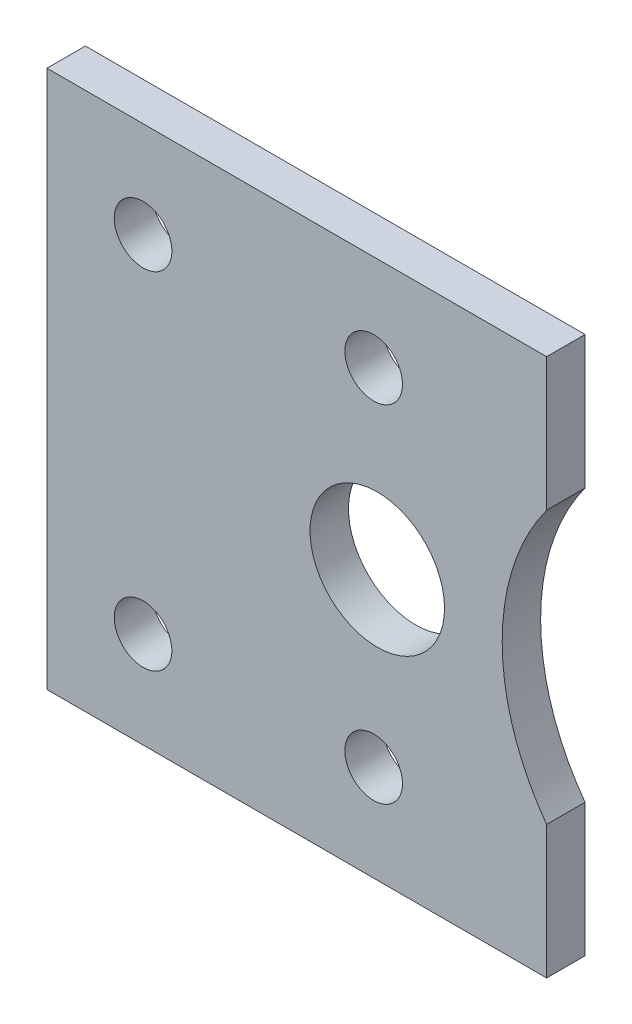
ISO-10303-21;
HEADER;
FILE_DESCRIPTION(('STEP AP214'),'2;1');
FILE_NAME('part.step','',(''),(''),'','','');
FILE_SCHEMA(('AUTOMOTIVE_DESIGN { 1 0 10303 214 1 1 1 1 }'));
ENDSEC;
DATA;
#1=APPLICATION_CONTEXT('core data for automotive mechanical design processes');
#2=APPLICATION_PROTOCOL_DEFINITION('international standard','automotive_design',2000,#1);
#3=PRODUCT_CONTEXT('',#1,'mechanical');
#4=PRODUCT('Part','Part','',(#3));
#5=PRODUCT_RELATED_PRODUCT_CATEGORY('part','',(#4));
#6=PRODUCT_DEFINITION_FORMATION('','',#4);
#7=PRODUCT_DEFINITION_CONTEXT('part definition',#1,'design');
#8=PRODUCT_DEFINITION('design','',#6,#7);
#9=PRODUCT_DEFINITION_SHAPE('','',#8);
#10=(LENGTH_UNIT() NAMED_UNIT(*) SI_UNIT(.MILLI.,.METRE.));
#11=(NAMED_UNIT(*) PLANE_ANGLE_UNIT() SI_UNIT($,.RADIAN.));
#12=(NAMED_UNIT(*) SI_UNIT($,.STERADIAN.) SOLID_ANGLE_UNIT());
#13=UNCERTAINTY_MEASURE_WITH_UNIT(LENGTH_MEASURE(1.E-05),#10,'distance_accuracy_value','');
#14=(GEOMETRIC_REPRESENTATION_CONTEXT(3) GLOBAL_UNCERTAINTY_ASSIGNED_CONTEXT((#13)) GLOBAL_UNIT_ASSIGNED_CONTEXT((#10,
#11,#12)) REPRESENTATION_CONTEXT('',''));
#15=CARTESIAN_POINT('',(0.,0.,0.));
#16=DIRECTION('',(0.,0.,1.));
#17=DIRECTION('',(1.,0.,0.));
#18=AXIS2_PLACEMENT_3D('',#15,#16,#17);
#19=CARTESIAN_POINT('',(35.6886954202667,14.,2.));
#20=DIRECTION('',(0.,0.,1.));
#21=DIRECTION('',(1.,0.,0.));
#22=AXIS2_PLACEMENT_3D('',#19,#20,#21);
#23=PLANE('',#22);
#24=CARTESIAN_POINT('',(17.,23.,2.));
#25=DIRECTION('',(0.,0.,1.));
#26=DIRECTION('',(-1.,0.,0.));
#27=AXIS2_PLACEMENT_3D('',#24,#25,#26);
#28=CIRCLE('',#27,1.5);
#29=CARTESIAN_POINT('',(15.5,23.,2.));
#30=VERTEX_POINT('',#29);
#31=EDGE_CURVE('E220',#30,#30,#28,.T.);
#32=ORIENTED_EDGE('',*,*,#31,.F.);
#33=EDGE_LOOP('',(#32));
#34=FACE_BOUND('',#33,.T.);
#35=CARTESIAN_POINT('',(17.,5.,2.));
#36=DIRECTION('',(0.,0.,1.));
#37=DIRECTION('',(1.,0.,0.));
#38=AXIS2_PLACEMENT_3D('',#35,#36,#37);
#39=CIRCLE('',#38,1.5);
#40=CARTESIAN_POINT('',(18.5,5.,2.));
#41=VERTEX_POINT('',#40);
#42=EDGE_CURVE('E236',#41,#41,#39,.T.);
#43=ORIENTED_EDGE('',*,*,#42,.F.);
#44=EDGE_LOOP('',(#43));
#45=FACE_BOUND('',#44,.T.);
#46=DIRECTION('',(1.,0.,0.));
#47=VECTOR('',#46,1.);
#48=CARTESIAN_POINT('',(0.,0.,2.));
#49=LINE('',#48,#47);
#50=CARTESIAN_POINT('',(0.,0.,2.));
#51=VERTEX_POINT('',#50);
#52=CARTESIAN_POINT('',(26.,0.,2.));
#53=VERTEX_POINT('',#52);
#54=EDGE_CURVE('E150',#51,#53,#49,.T.);
#55=ORIENTED_EDGE('',*,*,#54,.T.);
#56=DIRECTION('',(0.,1.,0.));
#57=VECTOR('',#56,1.);
#58=CARTESIAN_POINT('',(26.,0.,2.));
#59=LINE('',#58,#57);
#60=CARTESIAN_POINT('',(26.,6.91980360065467,2.));
#61=VERTEX_POINT('',#60);
#62=EDGE_CURVE('E98',#53,#61,#59,.T.);
#63=ORIENTED_EDGE('',*,*,#62,.T.);
#64=CARTESIAN_POINT('',(35.6886954202667,14.,2.));
#65=DIRECTION('',(0.,0.,-1.));
#66=DIRECTION('',(1.,0.,0.));
#67=AXIS2_PLACEMENT_3D('',#64,#65,#66);
#68=CIRCLE('',#67,12.);
#69=CARTESIAN_POINT('',(26.,21.0801963993453,2.));
#70=VERTEX_POINT('',#69);
#71=EDGE_CURVE('E111',#61,#70,#68,.T.);
#72=ORIENTED_EDGE('',*,*,#71,.T.);
#73=DIRECTION('',(0.,1.,0.));
#74=VECTOR('',#73,1.);
#75=CARTESIAN_POINT('',(26.,28.,2.));
#76=LINE('',#75,#74);
#77=CARTESIAN_POINT('',(26.,28.,2.));
#78=VERTEX_POINT('',#77);
#79=EDGE_CURVE('E105',#70,#78,#76,.T.);
#80=ORIENTED_EDGE('',*,*,#79,.T.);
#81=DIRECTION('',(-1.,0.,0.));
#82=VECTOR('',#81,1.);
#83=CARTESIAN_POINT('',(0.,28.,2.));
#84=LINE('',#83,#82);
#85=CARTESIAN_POINT('',(0.,28.,2.));
#86=VERTEX_POINT('',#85);
#87=EDGE_CURVE('E109',#78,#86,#84,.T.);
#88=ORIENTED_EDGE('',*,*,#87,.T.);
#89=DIRECTION('',(0.,-1.,0.));
#90=VECTOR('',#89,1.);
#91=CARTESIAN_POINT('',(0.,0.,2.));
#92=LINE('',#91,#90);
#93=EDGE_CURVE('E61',#86,#51,#92,.T.);
#94=ORIENTED_EDGE('',*,*,#93,.T.);
#95=EDGE_LOOP('',(#55,#63,#72,#80,#88,#94));
#96=FACE_BOUND('',#95,.T.);
#97=CARTESIAN_POINT('',(17.1886954202667,14.,2.));
#98=DIRECTION('',(0.,0.,1.));
#99=DIRECTION('',(1.,0.,0.));
#100=AXIS2_PLACEMENT_3D('',#97,#98,#99);
#101=CIRCLE('',#100,3.5);
#102=CARTESIAN_POINT('',(20.6886954202667,14.,2.));
#103=VERTEX_POINT('',#102);
#104=EDGE_CURVE('E138',#103,#103,#101,.T.);
#105=ORIENTED_EDGE('',*,*,#104,.F.);
#106=EDGE_LOOP('',(#105));
#107=FACE_BOUND('',#106,.T.);
#108=CARTESIAN_POINT('',(5.,5.,2.));
#109=DIRECTION('',(0.,0.,1.));
#110=DIRECTION('',(1.,0.,0.));
#111=AXIS2_PLACEMENT_3D('',#108,#109,#110);
#112=CIRCLE('',#111,1.5);
#113=CARTESIAN_POINT('',(6.5,5.,2.));
#114=VERTEX_POINT('',#113);
#115=EDGE_CURVE('E228',#114,#114,#112,.T.);
#116=ORIENTED_EDGE('',*,*,#115,.F.);
#117=EDGE_LOOP('',(#116));
#118=FACE_BOUND('',#117,.T.);
#119=CARTESIAN_POINT('',(5.,23.,2.));
#120=DIRECTION('',(0.,0.,1.));
#121=DIRECTION('',(-1.,0.,0.));
#122=AXIS2_PLACEMENT_3D('',#119,#120,#121);
#123=CIRCLE('',#122,1.5);
#124=CARTESIAN_POINT('',(3.5,23.,2.));
#125=VERTEX_POINT('',#124);
#126=EDGE_CURVE('E209',#125,#125,#123,.T.);
#127=ORIENTED_EDGE('',*,*,#126,.F.);
#128=EDGE_LOOP('',(#127));
#129=FACE_BOUND('',#128,.T.);
#130=ADVANCED_FACE('F43',(#34,#45,#96,#107,#118,#129),#23,.T.);
#131=CARTESIAN_POINT('',(35.6886954202667,14.,0.));
#132=DIRECTION('',(0.,0.,1.));
#133=DIRECTION('',(1.,0.,0.));
#134=AXIS2_PLACEMENT_3D('',#131,#132,#133);
#135=PLANE('',#134);
#136=DIRECTION('',(1.,0.,0.));
#137=VECTOR('',#136,1.);
#138=CARTESIAN_POINT('',(0.,0.,0.));
#139=LINE('',#138,#137);
#140=CARTESIAN_POINT('',(0.,0.,0.));
#141=VERTEX_POINT('',#140);
#142=CARTESIAN_POINT('',(26.,0.,0.));
#143=VERTEX_POINT('',#142);
#144=EDGE_CURVE('E133',#141,#143,#139,.T.);
#145=ORIENTED_EDGE('',*,*,#144,.F.);
#146=DIRECTION('',(0.,-1.,0.));
#147=VECTOR('',#146,1.);
#148=CARTESIAN_POINT('',(0.,0.,0.));
#149=LINE('',#148,#147);
#150=CARTESIAN_POINT('',(0.,28.,0.));
#151=VERTEX_POINT('',#150);
#152=EDGE_CURVE('E90',#151,#141,#149,.T.);
#153=ORIENTED_EDGE('',*,*,#152,.F.);
#154=DIRECTION('',(-1.,0.,0.));
#155=VECTOR('',#154,1.);
#156=CARTESIAN_POINT('',(0.,28.,0.));
#157=LINE('',#156,#155);
#158=CARTESIAN_POINT('',(26.,28.,0.));
#159=VERTEX_POINT('',#158);
#160=EDGE_CURVE('E84',#159,#151,#157,.T.);
#161=ORIENTED_EDGE('',*,*,#160,.F.);
#162=DIRECTION('',(0.,1.,0.));
#163=VECTOR('',#162,1.);
#164=CARTESIAN_POINT('',(26.,28.,0.));
#165=LINE('',#164,#163);
#166=CARTESIAN_POINT('',(26.,21.0801963993453,0.));
#167=VERTEX_POINT('',#166);
#168=EDGE_CURVE('E120',#167,#159,#165,.T.);
#169=ORIENTED_EDGE('',*,*,#168,.F.);
#170=CARTESIAN_POINT('',(35.6886954202667,14.,0.));
#171=DIRECTION('',(0.,0.,-1.));
#172=DIRECTION('',(1.,0.,0.));
#173=AXIS2_PLACEMENT_3D('',#170,#171,#172);
#174=CIRCLE('',#173,12.);
#175=CARTESIAN_POINT('',(26.,6.91980360065467,0.));
#176=VERTEX_POINT('',#175);
#177=EDGE_CURVE('E141',#176,#167,#174,.T.);
#178=ORIENTED_EDGE('',*,*,#177,.F.);
#179=DIRECTION('',(0.,1.,0.));
#180=VECTOR('',#179,1.);
#181=CARTESIAN_POINT('',(26.,0.,0.));
#182=LINE('',#181,#180);
#183=EDGE_CURVE('E137',#143,#176,#182,.T.);
#184=ORIENTED_EDGE('',*,*,#183,.F.);
#185=EDGE_LOOP('',(#145,#153,#161,#169,#178,#184));
#186=FACE_BOUND('',#185,.T.);
#187=CARTESIAN_POINT('',(17.1886954202667,14.,0.));
#188=DIRECTION('',(0.,0.,1.));
#189=DIRECTION('',(1.,0.,0.));
#190=AXIS2_PLACEMENT_3D('',#187,#188,#189);
#191=CIRCLE('',#190,3.5);
#192=CARTESIAN_POINT('',(20.6886954202667,14.,0.));
#193=VERTEX_POINT('',#192);
#194=EDGE_CURVE('E240',#193,#193,#191,.T.);
#195=ORIENTED_EDGE('',*,*,#194,.T.);
#196=EDGE_LOOP('',(#195));
#197=FACE_BOUND('',#196,.T.);
#198=CARTESIAN_POINT('',(17.,5.,0.));
#199=DIRECTION('',(0.,0.,1.));
#200=DIRECTION('',(1.,0.,0.));
#201=AXIS2_PLACEMENT_3D('',#198,#199,#200);
#202=CIRCLE('',#201,1.5);
#203=CARTESIAN_POINT('',(18.5,5.,0.));
#204=VERTEX_POINT('',#203);
#205=EDGE_CURVE('E232',#204,#204,#202,.T.);
#206=ORIENTED_EDGE('',*,*,#205,.T.);
#207=EDGE_LOOP('',(#206));
#208=FACE_BOUND('',#207,.T.);
#209=CARTESIAN_POINT('',(5.,5.,0.));
#210=DIRECTION('',(0.,0.,1.));
#211=DIRECTION('',(1.,0.,0.));
#212=AXIS2_PLACEMENT_3D('',#209,#210,#211);
#213=CIRCLE('',#212,1.5);
#214=CARTESIAN_POINT('',(6.5,5.,0.));
#215=VERTEX_POINT('',#214);
#216=EDGE_CURVE('E224',#215,#215,#213,.T.);
#217=ORIENTED_EDGE('',*,*,#216,.T.);
#218=EDGE_LOOP('',(#217));
#219=FACE_BOUND('',#218,.T.);
#220=CARTESIAN_POINT('',(17.,23.,0.));
#221=DIRECTION('',(0.,0.,1.));
#222=DIRECTION('',(-1.,0.,0.));
#223=AXIS2_PLACEMENT_3D('',#220,#221,#222);
#224=CIRCLE('',#223,1.5);
#225=CARTESIAN_POINT('',(15.5,23.,0.));
#226=VERTEX_POINT('',#225);
#227=EDGE_CURVE('E217',#226,#226,#224,.T.);
#228=ORIENTED_EDGE('',*,*,#227,.T.);
#229=EDGE_LOOP('',(#228));
#230=FACE_BOUND('',#229,.T.);
#231=CARTESIAN_POINT('',(5.,23.,0.));
#232=DIRECTION('',(0.,0.,1.));
#233=DIRECTION('',(-1.,0.,0.));
#234=AXIS2_PLACEMENT_3D('',#231,#232,#233);
#235=CIRCLE('',#234,1.5);
#236=CARTESIAN_POINT('',(3.5,23.,0.));
#237=VERTEX_POINT('',#236);
#238=EDGE_CURVE('E212',#237,#237,#235,.T.);
#239=ORIENTED_EDGE('',*,*,#238,.T.);
#240=EDGE_LOOP('',(#239));
#241=FACE_BOUND('',#240,.T.);
#242=ADVANCED_FACE('F163',(#186,#197,#208,#219,#230,#241),#135,.F.);
#243=CARTESIAN_POINT('',(0.,0.,2.));
#244=DIRECTION('',(0.,1.,0.));
#245=DIRECTION('',(0.,0.,1.));
#246=AXIS2_PLACEMENT_3D('',#243,#244,#245);
#247=PLANE('',#246);
#248=ORIENTED_EDGE('',*,*,#144,.T.);
#249=DIRECTION('',(0.,0.,-1.));
#250=VECTOR('',#249,1.);
#251=CARTESIAN_POINT('',(26.,0.,2.));
#252=LINE('',#251,#250);
#253=EDGE_CURVE('E11',#53,#143,#252,.T.);
#254=ORIENTED_EDGE('',*,*,#253,.F.);
#255=ORIENTED_EDGE('',*,*,#54,.F.);
#256=DIRECTION('',(0.,0.,-1.));
#257=VECTOR('',#256,1.);
#258=CARTESIAN_POINT('',(0.,0.,2.));
#259=LINE('',#258,#257);
#260=EDGE_CURVE('E129',#51,#141,#259,.T.);
#261=ORIENTED_EDGE('',*,*,#260,.T.);
#262=EDGE_LOOP('',(#248,#254,#255,#261));
#263=FACE_BOUND('',#262,.T.);
#264=ADVANCED_FACE('F45',(#263),#247,.F.);
#265=CARTESIAN_POINT('',(26.,0.,2.));
#266=DIRECTION('',(-1.,0.,0.));
#267=DIRECTION('',(0.,0.,1.));
#268=AXIS2_PLACEMENT_3D('',#265,#266,#267);
#269=PLANE('',#268);
#270=ORIENTED_EDGE('',*,*,#183,.T.);
#271=DIRECTION('',(0.,0.,-1.));
#272=VECTOR('',#271,1.);
#273=CARTESIAN_POINT('',(26.,6.91980360065467,2.));
#274=LINE('',#273,#272);
#275=EDGE_CURVE('E53',#61,#176,#274,.T.);
#276=ORIENTED_EDGE('',*,*,#275,.F.);
#277=ORIENTED_EDGE('',*,*,#62,.F.);
#278=ORIENTED_EDGE('',*,*,#253,.T.);
#279=EDGE_LOOP('',(#270,#276,#277,#278));
#280=FACE_BOUND('',#279,.T.);
#281=ADVANCED_FACE('F317',(#280),#269,.F.);
#282=CARTESIAN_POINT('',(35.6886954202667,14.,2.));
#283=DIRECTION('',(0.,0.,-1.));
#284=DIRECTION('',(-1.,0.,0.));
#285=AXIS2_PLACEMENT_3D('',#282,#283,#284);
#286=CYLINDRICAL_SURFACE('',#285,12.);
#287=ORIENTED_EDGE('',*,*,#177,.T.);
#288=DIRECTION('',(0.,0.,-1.));
#289=VECTOR('',#288,1.);
#290=CARTESIAN_POINT('',(26.,21.0801963993453,2.));
#291=LINE('',#290,#289);
#292=EDGE_CURVE('E122',#70,#167,#291,.T.);
#293=ORIENTED_EDGE('',*,*,#292,.F.);
#294=ORIENTED_EDGE('',*,*,#71,.F.);
#295=ORIENTED_EDGE('',*,*,#275,.T.);
#296=EDGE_LOOP('',(#287,#293,#294,#295));
#297=FACE_BOUND('',#296,.T.);
#298=ADVANCED_FACE('F160',(#297),#286,.F.);
#299=CARTESIAN_POINT('',(26.,28.,2.));
#300=DIRECTION('',(-1.,0.,0.));
#301=DIRECTION('',(0.,0.,1.));
#302=AXIS2_PLACEMENT_3D('',#299,#300,#301);
#303=PLANE('',#302);
#304=ORIENTED_EDGE('',*,*,#168,.T.);
#305=DIRECTION('',(0.,0.,-1.));
#306=VECTOR('',#305,1.);
#307=CARTESIAN_POINT('',(26.,28.,2.));
#308=LINE('',#307,#306);
#309=EDGE_CURVE('E117',#78,#159,#308,.T.);
#310=ORIENTED_EDGE('',*,*,#309,.F.);
#311=ORIENTED_EDGE('',*,*,#79,.F.);
#312=ORIENTED_EDGE('',*,*,#292,.T.);
#313=EDGE_LOOP('',(#304,#310,#311,#312));
#314=FACE_BOUND('',#313,.T.);
#315=ADVANCED_FACE('F118',(#314),#303,.F.);
#316=CARTESIAN_POINT('',(0.,28.,2.));
#317=DIRECTION('',(0.,-1.,0.));
#318=DIRECTION('',(0.,0.,-1.));
#319=AXIS2_PLACEMENT_3D('',#316,#317,#318);
#320=PLANE('',#319);
#321=ORIENTED_EDGE('',*,*,#160,.T.);
#322=DIRECTION('',(0.,0.,-1.));
#323=VECTOR('',#322,1.);
#324=CARTESIAN_POINT('',(0.,28.,2.));
#325=LINE('',#324,#323);
#326=EDGE_CURVE('E123',#86,#151,#325,.T.);
#327=ORIENTED_EDGE('',*,*,#326,.F.);
#328=ORIENTED_EDGE('',*,*,#87,.F.);
#329=ORIENTED_EDGE('',*,*,#309,.T.);
#330=EDGE_LOOP('',(#321,#327,#328,#329));
#331=FACE_BOUND('',#330,.T.);
#332=ADVANCED_FACE('F125',(#331),#320,.F.);
#333=CARTESIAN_POINT('',(0.,0.,2.));
#334=DIRECTION('',(1.,0.,0.));
#335=DIRECTION('',(0.,0.,-1.));
#336=AXIS2_PLACEMENT_3D('',#333,#334,#335);
#337=PLANE('',#336);
#338=ORIENTED_EDGE('',*,*,#152,.T.);
#339=ORIENTED_EDGE('',*,*,#260,.F.);
#340=ORIENTED_EDGE('',*,*,#93,.F.);
#341=ORIENTED_EDGE('',*,*,#326,.T.);
#342=EDGE_LOOP('',(#338,#339,#340,#341));
#343=FACE_BOUND('',#342,.T.);
#344=ADVANCED_FACE('F168',(#343),#337,.F.);
#345=CARTESIAN_POINT('',(17.1886954202667,14.,2.));
#346=DIRECTION('',(0.,0.,-1.));
#347=DIRECTION('',(-1.,0.,0.));
#348=AXIS2_PLACEMENT_3D('',#345,#346,#347);
#349=CYLINDRICAL_SURFACE('',#348,3.5);
#350=ORIENTED_EDGE('',*,*,#104,.T.);
#351=EDGE_LOOP('',(#350));
#352=FACE_BOUND('',#351,.T.);
#353=ORIENTED_EDGE('',*,*,#194,.F.);
#354=EDGE_LOOP('',(#353));
#355=FACE_BOUND('',#354,.T.);
#356=ADVANCED_FACE('F170',(#352,#355),#349,.F.);
#357=CARTESIAN_POINT('',(17.,5.,2.));
#358=DIRECTION('',(0.,0.,-1.));
#359=DIRECTION('',(-1.,0.,0.));
#360=AXIS2_PLACEMENT_3D('',#357,#358,#359);
#361=CYLINDRICAL_SURFACE('',#360,1.5);
#362=ORIENTED_EDGE('',*,*,#42,.T.);
#363=EDGE_LOOP('',(#362));
#364=FACE_BOUND('',#363,.T.);
#365=ORIENTED_EDGE('',*,*,#205,.F.);
#366=EDGE_LOOP('',(#365));
#367=FACE_BOUND('',#366,.T.);
#368=ADVANCED_FACE('F176',(#364,#367),#361,.F.);
#369=CARTESIAN_POINT('',(5.,5.,2.));
#370=DIRECTION('',(0.,0.,-1.));
#371=DIRECTION('',(-1.,0.,0.));
#372=AXIS2_PLACEMENT_3D('',#369,#370,#371);
#373=CYLINDRICAL_SURFACE('',#372,1.5);
#374=ORIENTED_EDGE('',*,*,#115,.T.);
#375=EDGE_LOOP('',(#374));
#376=FACE_BOUND('',#375,.T.);
#377=ORIENTED_EDGE('',*,*,#216,.F.);
#378=EDGE_LOOP('',(#377));
#379=FACE_BOUND('',#378,.T.);
#380=ADVANCED_FACE('F192',(#376,#379),#373,.F.);
#381=CARTESIAN_POINT('',(17.,23.,2.));
#382=DIRECTION('',(0.,0.,-1.));
#383=DIRECTION('',(-1.,0.,0.));
#384=AXIS2_PLACEMENT_3D('',#381,#382,#383);
#385=CYLINDRICAL_SURFACE('',#384,1.5);
#386=ORIENTED_EDGE('',*,*,#31,.T.);
#387=EDGE_LOOP('',(#386));
#388=FACE_BOUND('',#387,.T.);
#389=ORIENTED_EDGE('',*,*,#227,.F.);
#390=EDGE_LOOP('',(#389));
#391=FACE_BOUND('',#390,.T.);
#392=ADVANCED_FACE('F196',(#388,#391),#385,.F.);
#393=CARTESIAN_POINT('',(5.,23.,2.));
#394=DIRECTION('',(0.,0.,-1.));
#395=DIRECTION('',(-1.,0.,0.));
#396=AXIS2_PLACEMENT_3D('',#393,#394,#395);
#397=CYLINDRICAL_SURFACE('',#396,1.5);
#398=ORIENTED_EDGE('',*,*,#126,.T.);
#399=EDGE_LOOP('',(#398));
#400=FACE_BOUND('',#399,.T.);
#401=ORIENTED_EDGE('',*,*,#238,.F.);
#402=EDGE_LOOP('',(#401));
#403=FACE_BOUND('',#402,.T.);
#404=ADVANCED_FACE('F200',(#400,#403),#397,.F.);
#405=CLOSED_SHELL('',(#130,#242,#264,#281,#298,#315,#332,#344,#356,#368,#380,#392,#404));
#406=MANIFOLD_SOLID_BREP('B2',#405);
#407=ADVANCED_BREP_SHAPE_REPRESENTATION('',(#18,#406),#14);
#408=SHAPE_DEFINITION_REPRESENTATION(#9,#407);
ENDSEC;
END-ISO-10303-21;
